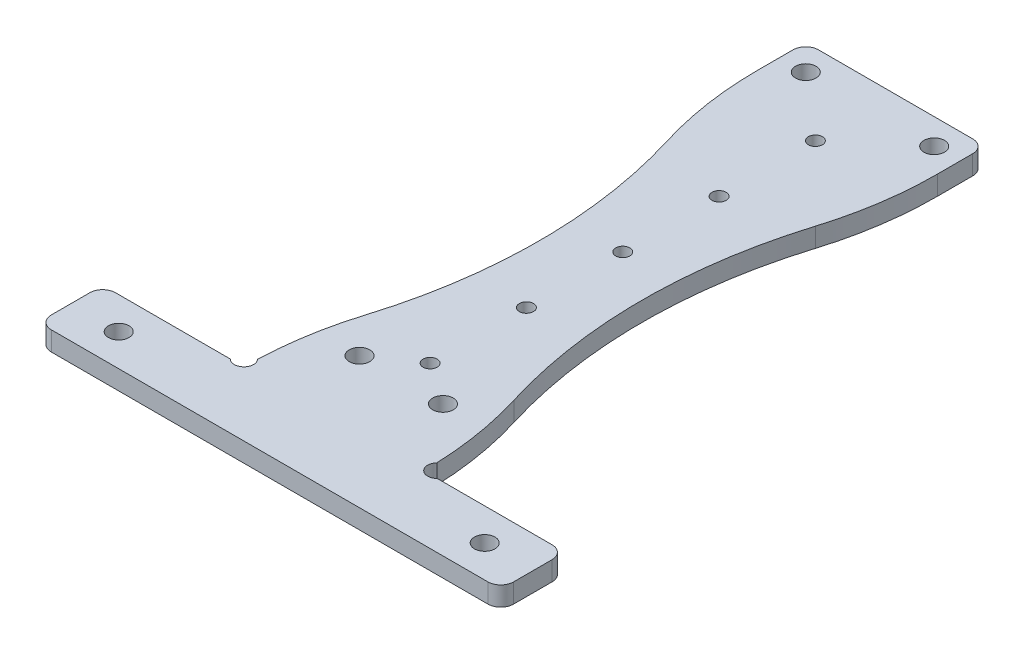
ISO-10303-21;
HEADER;
FILE_DESCRIPTION(('STEP AP214'),'2;1');
FILE_NAME('part.step','',(''),(''),'','','');
FILE_SCHEMA(('AUTOMOTIVE_DESIGN { 1 0 10303 214 1 1 1 1 }'));
ENDSEC;
DATA;
#1=APPLICATION_CONTEXT('core data for automotive mechanical design processes');
#2=APPLICATION_PROTOCOL_DEFINITION('international standard','automotive_design',2000,#1);
#3=PRODUCT_CONTEXT('',#1,'mechanical');
#4=PRODUCT('Part','Part','',(#3));
#5=PRODUCT_RELATED_PRODUCT_CATEGORY('part','',(#4));
#6=PRODUCT_DEFINITION_FORMATION('','',#4);
#7=PRODUCT_DEFINITION_CONTEXT('part definition',#1,'design');
#8=PRODUCT_DEFINITION('design','',#6,#7);
#9=PRODUCT_DEFINITION_SHAPE('','',#8);
#10=(LENGTH_UNIT() NAMED_UNIT(*) SI_UNIT(.MILLI.,.METRE.));
#11=(NAMED_UNIT(*) PLANE_ANGLE_UNIT() SI_UNIT($,.RADIAN.));
#12=(NAMED_UNIT(*) SI_UNIT($,.STERADIAN.) SOLID_ANGLE_UNIT());
#13=UNCERTAINTY_MEASURE_WITH_UNIT(LENGTH_MEASURE(1.E-05),#10,'distance_accuracy_value','');
#14=(GEOMETRIC_REPRESENTATION_CONTEXT(3) GLOBAL_UNCERTAINTY_ASSIGNED_CONTEXT((#13)) GLOBAL_UNIT_ASSIGNED_CONTEXT((#10,
#11,#12)) REPRESENTATION_CONTEXT('',''));
#15=CARTESIAN_POINT('',(0.,0.,0.));
#16=DIRECTION('',(0.,0.,1.));
#17=DIRECTION('',(1.,0.,0.));
#18=AXIS2_PLACEMENT_3D('',#15,#16,#17);
#19=CARTESIAN_POINT('',(-42.3333333333289,3.,-90.));
#20=DIRECTION('',(0.,-1.,0.));
#21=DIRECTION('',(0.,0.,-1.));
#22=AXIS2_PLACEMENT_3D('',#19,#20,#21);
#23=CYLINDRICAL_SURFACE('',#22,56.3333333333291);
#24=CARTESIAN_POINT('',(-42.3333333333289,0.,-90.));
#25=DIRECTION('',(0.,1.,0.));
#26=DIRECTION('',(0.,0.,1.));
#27=AXIS2_PLACEMENT_3D('',#24,#25,#26);
#28=CIRCLE('',#27,56.3333333333291);
#29=CARTESIAN_POINT('',(14.,0.,-90.));
#30=VERTEX_POINT('',#29);
#31=CARTESIAN_POINT('',(11.5207823960883,0.,-73.4718826405876));
#32=VERTEX_POINT('',#31);
#33=EDGE_CURVE('E193',#30,#32,#28,.F.);
#34=ORIENTED_EDGE('',*,*,#33,.F.);
#35=DIRECTION('',(0.,-1.,0.));
#36=VECTOR('',#35,1.);
#37=CARTESIAN_POINT('',(14.,3.,-90.));
#38=LINE('',#37,#36);
#39=CARTESIAN_POINT('',(14.,3.,-90.));
#40=VERTEX_POINT('',#39);
#41=EDGE_CURVE('E187',#40,#30,#38,.T.);
#42=ORIENTED_EDGE('',*,*,#41,.F.);
#43=CARTESIAN_POINT('',(-42.3333333333289,3.,-90.));
#44=DIRECTION('',(0.,1.,0.));
#45=DIRECTION('',(0.,0.,1.));
#46=AXIS2_PLACEMENT_3D('',#43,#44,#45);
#47=CIRCLE('',#46,56.3333333333291);
#48=CARTESIAN_POINT('',(11.5207823960883,3.,-73.4718826405876));
#49=VERTEX_POINT('',#48);
#50=EDGE_CURVE('E190',#40,#49,#47,.F.);
#51=ORIENTED_EDGE('',*,*,#50,.T.);
#52=DIRECTION('',(0.,-1.,0.));
#53=VECTOR('',#52,1.);
#54=CARTESIAN_POINT('',(11.5207823960883,3.,-73.4718826405876));
#55=LINE('',#54,#53);
#56=EDGE_CURVE('E259',#49,#32,#55,.T.);
#57=ORIENTED_EDGE('',*,*,#56,.T.);
#58=EDGE_LOOP('',(#34,#42,#51,#57));
#59=FACE_BOUND('',#58,.T.);
#60=ADVANCED_FACE('F37',(#59),#23,.T.);
#61=CARTESIAN_POINT('',(14.,3.,0.));
#62=DIRECTION('',(-1.,0.,0.));
#63=DIRECTION('',(0.,0.,1.));
#64=AXIS2_PLACEMENT_3D('',#61,#62,#63);
#65=PLANE('',#64);
#66=DIRECTION('',(0.,0.,-1.));
#67=VECTOR('',#66,1.);
#68=CARTESIAN_POINT('',(14.,0.,0.));
#69=LINE('',#68,#67);
#70=CARTESIAN_POINT('',(14.,0.,-95.5));
#71=VERTEX_POINT('',#70);
#72=EDGE_CURVE('E288',#30,#71,#69,.T.);
#73=ORIENTED_EDGE('',*,*,#72,.T.);
#74=DIRECTION('',(0.,-1.,0.));
#75=VECTOR('',#74,1.);
#76=CARTESIAN_POINT('',(14.,3.,-95.5));
#77=LINE('',#76,#75);
#78=CARTESIAN_POINT('',(14.,3.,-95.5));
#79=VERTEX_POINT('',#78);
#80=EDGE_CURVE('E11',#71,#79,#77,.F.);
#81=ORIENTED_EDGE('',*,*,#80,.T.);
#82=DIRECTION('',(0.,0.,-1.));
#83=VECTOR('',#82,1.);
#84=CARTESIAN_POINT('',(14.,3.,0.));
#85=LINE('',#84,#83);
#86=EDGE_CURVE('E201',#40,#79,#85,.T.);
#87=ORIENTED_EDGE('',*,*,#86,.F.);
#88=ORIENTED_EDGE('',*,*,#41,.T.);
#89=EDGE_LOOP('',(#73,#81,#87,#88));
#90=FACE_BOUND('',#89,.T.);
#91=ADVANCED_FACE('F202',(#90),#65,.F.);
#92=CARTESIAN_POINT('',(0.,3.,-97.5));
#93=DIRECTION('',(0.,0.,1.));
#94=DIRECTION('',(1.,0.,0.));
#95=AXIS2_PLACEMENT_3D('',#92,#93,#94);
#96=PLANE('',#95);
#97=DIRECTION('',(-1.,0.,0.));
#98=VECTOR('',#97,1.);
#99=CARTESIAN_POINT('',(0.,0.,-97.5));
#100=LINE('',#99,#98);
#101=CARTESIAN_POINT('',(12.,0.,-97.5));
#102=VERTEX_POINT('',#101);
#103=CARTESIAN_POINT('',(-12.,0.,-97.5));
#104=VERTEX_POINT('',#103);
#105=EDGE_CURVE('E290',#102,#104,#100,.T.);
#106=ORIENTED_EDGE('',*,*,#105,.T.);
#107=DIRECTION('',(0.,-1.,0.));
#108=VECTOR('',#107,1.);
#109=CARTESIAN_POINT('',(-12.,3.,-97.5));
#110=LINE('',#109,#108);
#111=CARTESIAN_POINT('',(-12.,3.,-97.5));
#112=VERTEX_POINT('',#111);
#113=EDGE_CURVE('E45',#104,#112,#110,.F.);
#114=ORIENTED_EDGE('',*,*,#113,.T.);
#115=DIRECTION('',(-1.,0.,0.));
#116=VECTOR('',#115,1.);
#117=CARTESIAN_POINT('',(0.,3.,-97.5));
#118=LINE('',#117,#116);
#119=CARTESIAN_POINT('',(12.,3.,-97.5));
#120=VERTEX_POINT('',#119);
#121=EDGE_CURVE('E205',#120,#112,#118,.T.);
#122=ORIENTED_EDGE('',*,*,#121,.F.);
#123=DIRECTION('',(0.,-1.,0.));
#124=VECTOR('',#123,1.);
#125=CARTESIAN_POINT('',(12.,3.,-97.5));
#126=LINE('',#125,#124);
#127=EDGE_CURVE('E400',#120,#102,#126,.T.);
#128=ORIENTED_EDGE('',*,*,#127,.T.);
#129=EDGE_LOOP('',(#106,#114,#122,#128));
#130=FACE_BOUND('',#129,.T.);
#131=ADVANCED_FACE('F405',(#130),#96,.F.);
#132=CARTESIAN_POINT('',(-14.,3.,0.));
#133=DIRECTION('',(-1.,0.,0.));
#134=DIRECTION('',(0.,0.,1.));
#135=AXIS2_PLACEMENT_3D('',#132,#133,#134);
#136=PLANE('',#135);
#137=DIRECTION('',(0.,0.,-1.));
#138=VECTOR('',#137,1.);
#139=CARTESIAN_POINT('',(-14.,3.,0.));
#140=LINE('',#139,#138);
#141=CARTESIAN_POINT('',(-14.,3.,-89.9999999999999));
#142=VERTEX_POINT('',#141);
#143=CARTESIAN_POINT('',(-14.,3.,-95.5));
#144=VERTEX_POINT('',#143);
#145=EDGE_CURVE('E222',#142,#144,#140,.T.);
#146=ORIENTED_EDGE('',*,*,#145,.T.);
#147=DIRECTION('',(0.,-1.,0.));
#148=VECTOR('',#147,1.);
#149=CARTESIAN_POINT('',(-14.,0.,-95.5));
#150=LINE('',#149,#148);
#151=CARTESIAN_POINT('',(-14.,0.,-95.5));
#152=VERTEX_POINT('',#151);
#153=EDGE_CURVE('E397',#144,#152,#150,.T.);
#154=ORIENTED_EDGE('',*,*,#153,.T.);
#155=DIRECTION('',(0.,0.,-1.));
#156=VECTOR('',#155,1.);
#157=CARTESIAN_POINT('',(-14.,0.,0.));
#158=LINE('',#157,#156);
#159=CARTESIAN_POINT('',(-14.,0.,-89.9999999999999));
#160=VERTEX_POINT('',#159);
#161=EDGE_CURVE('E293',#160,#152,#158,.T.);
#162=ORIENTED_EDGE('',*,*,#161,.F.);
#163=DIRECTION('',(0.,-1.,0.));
#164=VECTOR('',#163,1.);
#165=CARTESIAN_POINT('',(-14.,3.,-89.9999999999999));
#166=LINE('',#165,#164);
#167=EDGE_CURVE('E198',#142,#160,#166,.T.);
#168=ORIENTED_EDGE('',*,*,#167,.F.);
#169=EDGE_LOOP('',(#146,#154,#162,#168));
#170=FACE_BOUND('',#169,.T.);
#171=ADVANCED_FACE('F415',(#170),#136,.T.);
#172=CARTESIAN_POINT('',(42.3333333333292,3.,-89.9999999999999));
#173=DIRECTION('',(0.,-1.,0.));
#174=DIRECTION('',(0.,0.,-1.));
#175=AXIS2_PLACEMENT_3D('',#172,#173,#174);
#176=CYLINDRICAL_SURFACE('',#175,56.3333333333293);
#177=CARTESIAN_POINT('',(42.3333333333292,0.,-89.9999999999999));
#178=DIRECTION('',(0.,1.,0.));
#179=DIRECTION('',(0.,0.,1.));
#180=AXIS2_PLACEMENT_3D('',#177,#178,#179);
#181=CIRCLE('',#180,56.3333333333293);
#182=CARTESIAN_POINT('',(-11.5207823960882,0.,-73.4718826405876));
#183=VERTEX_POINT('',#182);
#184=EDGE_CURVE('E296',#160,#183,#181,.T.);
#185=ORIENTED_EDGE('',*,*,#184,.T.);
#186=DIRECTION('',(0.,-1.,0.));
#187=VECTOR('',#186,1.);
#188=CARTESIAN_POINT('',(-11.5207823960882,3.,-73.4718826405876));
#189=LINE('',#188,#187);
#190=CARTESIAN_POINT('',(-11.5207823960882,3.,-73.4718826405876));
#191=VERTEX_POINT('',#190);
#192=EDGE_CURVE('E352',#191,#183,#189,.T.);
#193=ORIENTED_EDGE('',*,*,#192,.F.);
#194=CARTESIAN_POINT('',(42.3333333333292,3.,-89.9999999999999));
#195=DIRECTION('',(0.,1.,0.));
#196=DIRECTION('',(0.,0.,1.));
#197=AXIS2_PLACEMENT_3D('',#194,#195,#196);
#198=CIRCLE('',#197,56.3333333333293);
#199=EDGE_CURVE('E225',#142,#191,#198,.T.);
#200=ORIENTED_EDGE('',*,*,#199,.F.);
#201=ORIENTED_EDGE('',*,*,#167,.T.);
#202=EDGE_LOOP('',(#185,#193,#200,#201));
#203=FACE_BOUND('',#202,.T.);
#204=ADVANCED_FACE('F423',(#203),#176,.T.);
#205=CARTESIAN_POINT('',(-88.0000000000002,3.,-50.));
#206=DIRECTION('',(0.,-1.,0.));
#207=DIRECTION('',(0.,0.,-1.));
#208=AXIS2_PLACEMENT_3D('',#205,#206,#207);
#209=CYLINDRICAL_SURFACE('',#208,80.0000000000002);
#210=CARTESIAN_POINT('',(-88.0000000000002,0.,-50.));
#211=DIRECTION('',(0.,1.,0.));
#212=DIRECTION('',(0.,0.,1.));
#213=AXIS2_PLACEMENT_3D('',#210,#211,#212);
#214=CIRCLE('',#213,80.0000000000002);
#215=CARTESIAN_POINT('',(-11.5207823960883,0.,-26.5281173594124));
#216=VERTEX_POINT('',#215);
#217=EDGE_CURVE('E299',#183,#216,#214,.F.);
#218=ORIENTED_EDGE('',*,*,#217,.T.);
#219=DIRECTION('',(0.,-1.,0.));
#220=VECTOR('',#219,1.);
#221=CARTESIAN_POINT('',(-11.5207823960883,3.,-26.5281173594124));
#222=LINE('',#221,#220);
#223=CARTESIAN_POINT('',(-11.5207823960883,3.,-26.5281173594124));
#224=VERTEX_POINT('',#223);
#225=EDGE_CURVE('E349',#224,#216,#222,.T.);
#226=ORIENTED_EDGE('',*,*,#225,.F.);
#227=CARTESIAN_POINT('',(-88.0000000000002,3.,-50.));
#228=DIRECTION('',(0.,1.,0.));
#229=DIRECTION('',(0.,0.,1.));
#230=AXIS2_PLACEMENT_3D('',#227,#228,#229);
#231=CIRCLE('',#230,80.0000000000002);
#232=EDGE_CURVE('E228',#191,#224,#231,.F.);
#233=ORIENTED_EDGE('',*,*,#232,.F.);
#234=ORIENTED_EDGE('',*,*,#192,.T.);
#235=EDGE_LOOP('',(#218,#226,#233,#234));
#236=FACE_BOUND('',#235,.T.);
#237=ADVANCED_FACE('F429',(#236),#209,.F.);
#238=CARTESIAN_POINT('',(42.333333333329,3.,-9.99999999999999));
#239=DIRECTION('',(0.,-1.,0.));
#240=DIRECTION('',(0.,0.,-1.));
#241=AXIS2_PLACEMENT_3D('',#238,#239,#240);
#242=CYLINDRICAL_SURFACE('',#241,56.3333333333292);
#243=CARTESIAN_POINT('',(42.333333333329,0.,-9.99999999999999));
#244=DIRECTION('',(0.,1.,0.));
#245=DIRECTION('',(0.,0.,1.));
#246=AXIS2_PLACEMENT_3D('',#243,#244,#245);
#247=CIRCLE('',#246,56.3333333333292);
#248=CARTESIAN_POINT('',(-13.9615349073017,0.,-12.0814067872462));
#249=VERTEX_POINT('',#248);
#250=EDGE_CURVE('E302',#216,#249,#247,.T.);
#251=ORIENTED_EDGE('',*,*,#250,.T.);
#252=DIRECTION('',(0.,-1.,0.));
#253=VECTOR('',#252,1.);
#254=CARTESIAN_POINT('',(-13.9615349073017,3.,-12.0814067872462));
#255=LINE('',#254,#253);
#256=CARTESIAN_POINT('',(-13.9615349073017,3.,-12.0814067872462));
#257=VERTEX_POINT('',#256);
#258=EDGE_CURVE('E347',#257,#249,#255,.T.);
#259=ORIENTED_EDGE('',*,*,#258,.F.);
#260=CARTESIAN_POINT('',(42.333333333329,3.,-9.99999999999999));
#261=DIRECTION('',(0.,1.,0.));
#262=DIRECTION('',(0.,0.,1.));
#263=AXIS2_PLACEMENT_3D('',#260,#261,#262);
#264=CIRCLE('',#263,56.3333333333292);
#265=EDGE_CURVE('E231',#224,#257,#264,.T.);
#266=ORIENTED_EDGE('',*,*,#265,.F.);
#267=ORIENTED_EDGE('',*,*,#225,.T.);
#268=EDGE_LOOP('',(#251,#259,#266,#267));
#269=FACE_BOUND('',#268,.T.);
#270=ADVANCED_FACE('F431',(#269),#242,.T.);
#271=CARTESIAN_POINT('',(-15.0606601717798,3.,-11.0606601717798));
#272=DIRECTION('',(0.,-1.,0.));
#273=DIRECTION('',(0.,0.,-1.));
#274=AXIS2_PLACEMENT_3D('',#271,#272,#273);
#275=CYLINDRICAL_SURFACE('',#274,1.50000000000001);
#276=CARTESIAN_POINT('',(-15.0606601717798,0.,-11.0606601717798));
#277=DIRECTION('',(0.,1.,0.));
#278=DIRECTION('',(0.,0.,1.));
#279=AXIS2_PLACEMENT_3D('',#276,#277,#278);
#280=CIRCLE('',#279,1.50000000000001);
#281=CARTESIAN_POINT('',(-16.1213203435596,0.,-10.));
#282=VERTEX_POINT('',#281);
#283=EDGE_CURVE('E305',#282,#249,#280,.T.);
#284=ORIENTED_EDGE('',*,*,#283,.F.);
#285=DIRECTION('',(0.,-1.,0.));
#286=VECTOR('',#285,1.);
#287=CARTESIAN_POINT('',(-16.1213203435596,3.,-10.));
#288=LINE('',#287,#286);
#289=CARTESIAN_POINT('',(-16.1213203435596,3.,-10.));
#290=VERTEX_POINT('',#289);
#291=EDGE_CURVE('E344',#290,#282,#288,.T.);
#292=ORIENTED_EDGE('',*,*,#291,.F.);
#293=CARTESIAN_POINT('',(-15.0606601717798,3.,-11.0606601717798));
#294=DIRECTION('',(0.,1.,0.));
#295=DIRECTION('',(0.,0.,1.));
#296=AXIS2_PLACEMENT_3D('',#293,#294,#295);
#297=CIRCLE('',#296,1.50000000000001);
#298=EDGE_CURVE('E233',#290,#257,#297,.T.);
#299=ORIENTED_EDGE('',*,*,#298,.T.);
#300=ORIENTED_EDGE('',*,*,#258,.T.);
#301=EDGE_LOOP('',(#284,#292,#299,#300));
#302=FACE_BOUND('',#301,.T.);
#303=ADVANCED_FACE('F435',(#302),#275,.F.);
#304=CARTESIAN_POINT('',(0.,3.,-10.));
#305=DIRECTION('',(0.,0.,-1.));
#306=DIRECTION('',(-1.,0.,0.));
#307=AXIS2_PLACEMENT_3D('',#304,#305,#306);
#308=PLANE('',#307);
#309=DIRECTION('',(1.,0.,0.));
#310=VECTOR('',#309,1.);
#311=CARTESIAN_POINT('',(0.,0.,-10.));
#312=LINE('',#311,#310);
#313=CARTESIAN_POINT('',(-34.,0.,-10.));
#314=VERTEX_POINT('',#313);
#315=EDGE_CURVE('E308',#314,#282,#312,.T.);
#316=ORIENTED_EDGE('',*,*,#315,.F.);
#317=DIRECTION('',(0.,-1.,0.));
#318=VECTOR('',#317,1.);
#319=CARTESIAN_POINT('',(-34.,3.,-10.));
#320=LINE('',#319,#318);
#321=CARTESIAN_POINT('',(-34.,3.,-10.));
#322=VERTEX_POINT('',#321);
#323=EDGE_CURVE('E395',#314,#322,#320,.F.);
#324=ORIENTED_EDGE('',*,*,#323,.T.);
#325=DIRECTION('',(1.,0.,0.));
#326=VECTOR('',#325,1.);
#327=CARTESIAN_POINT('',(0.,3.,-10.));
#328=LINE('',#327,#326);
#329=EDGE_CURVE('E236',#322,#290,#328,.T.);
#330=ORIENTED_EDGE('',*,*,#329,.T.);
#331=ORIENTED_EDGE('',*,*,#291,.T.);
#332=EDGE_LOOP('',(#316,#324,#330,#331));
#333=FACE_BOUND('',#332,.T.);
#334=ADVANCED_FACE('F698',(#333),#308,.T.);
#335=CARTESIAN_POINT('',(-36.,3.,0.));
#336=DIRECTION('',(-1.,0.,0.));
#337=DIRECTION('',(0.,0.,1.));
#338=AXIS2_PLACEMENT_3D('',#335,#336,#337);
#339=PLANE('',#338);
#340=DIRECTION('',(0.,0.,-1.));
#341=VECTOR('',#340,1.);
#342=CARTESIAN_POINT('',(-36.,0.,0.));
#343=LINE('',#342,#341);
#344=CARTESIAN_POINT('',(-36.,0.,-2.));
#345=VERTEX_POINT('',#344);
#346=CARTESIAN_POINT('',(-36.,0.,-8.));
#347=VERTEX_POINT('',#346);
#348=EDGE_CURVE('E310',#345,#347,#343,.T.);
#349=ORIENTED_EDGE('',*,*,#348,.F.);
#350=DIRECTION('',(0.,-1.,0.));
#351=VECTOR('',#350,1.);
#352=CARTESIAN_POINT('',(-36.,3.,-2.));
#353=LINE('',#352,#351);
#354=CARTESIAN_POINT('',(-36.,3.,-2.));
#355=VERTEX_POINT('',#354);
#356=EDGE_CURVE('E393',#345,#355,#353,.F.);
#357=ORIENTED_EDGE('',*,*,#356,.T.);
#358=DIRECTION('',(0.,0.,-1.));
#359=VECTOR('',#358,1.);
#360=CARTESIAN_POINT('',(-36.,3.,0.));
#361=LINE('',#360,#359);
#362=CARTESIAN_POINT('',(-36.,3.,-8.));
#363=VERTEX_POINT('',#362);
#364=EDGE_CURVE('E238',#355,#363,#361,.T.);
#365=ORIENTED_EDGE('',*,*,#364,.T.);
#366=DIRECTION('',(0.,-1.,0.));
#367=VECTOR('',#366,1.);
#368=CARTESIAN_POINT('',(-36.,3.,-8.));
#369=LINE('',#368,#367);
#370=EDGE_CURVE('E390',#363,#347,#369,.T.);
#371=ORIENTED_EDGE('',*,*,#370,.T.);
#372=EDGE_LOOP('',(#349,#357,#365,#371));
#373=FACE_BOUND('',#372,.T.);
#374=ADVANCED_FACE('F445',(#373),#339,.T.);
#375=CARTESIAN_POINT('',(0.,3.,0.));
#376=DIRECTION('',(0.,0.,-1.));
#377=DIRECTION('',(-1.,0.,0.));
#378=AXIS2_PLACEMENT_3D('',#375,#376,#377);
#379=PLANE('',#378);
#380=DIRECTION('',(1.,0.,0.));
#381=VECTOR('',#380,1.);
#382=CARTESIAN_POINT('',(0.,0.,0.));
#383=LINE('',#382,#381);
#384=CARTESIAN_POINT('',(-34.,0.,0.));
#385=VERTEX_POINT('',#384);
#386=CARTESIAN_POINT('',(34.,0.,0.));
#387=VERTEX_POINT('',#386);
#388=EDGE_CURVE('E313',#385,#387,#383,.T.);
#389=ORIENTED_EDGE('',*,*,#388,.T.);
#390=DIRECTION('',(0.,-1.,0.));
#391=VECTOR('',#390,1.);
#392=CARTESIAN_POINT('',(34.,3.,0.));
#393=LINE('',#392,#391);
#394=CARTESIAN_POINT('',(34.,3.,0.));
#395=VERTEX_POINT('',#394);
#396=EDGE_CURVE('E52',#387,#395,#393,.F.);
#397=ORIENTED_EDGE('',*,*,#396,.T.);
#398=DIRECTION('',(1.,0.,0.));
#399=VECTOR('',#398,1.);
#400=CARTESIAN_POINT('',(0.,3.,0.));
#401=LINE('',#400,#399);
#402=CARTESIAN_POINT('',(-34.,3.,0.));
#403=VERTEX_POINT('',#402);
#404=EDGE_CURVE('E241',#403,#395,#401,.T.);
#405=ORIENTED_EDGE('',*,*,#404,.F.);
#406=DIRECTION('',(0.,-1.,0.));
#407=VECTOR('',#406,1.);
#408=CARTESIAN_POINT('',(-34.,0.,0.));
#409=LINE('',#408,#407);
#410=EDGE_CURVE('E386',#403,#385,#409,.T.);
#411=ORIENTED_EDGE('',*,*,#410,.T.);
#412=EDGE_LOOP('',(#389,#397,#405,#411));
#413=FACE_BOUND('',#412,.T.);
#414=ADVANCED_FACE('F452',(#413),#379,.F.);
#415=CARTESIAN_POINT('',(36.,3.,0.));
#416=DIRECTION('',(-1.,0.,0.));
#417=DIRECTION('',(0.,0.,1.));
#418=AXIS2_PLACEMENT_3D('',#415,#416,#417);
#419=PLANE('',#418);
#420=DIRECTION('',(0.,0.,-1.));
#421=VECTOR('',#420,1.);
#422=CARTESIAN_POINT('',(36.,0.,0.));
#423=LINE('',#422,#421);
#424=CARTESIAN_POINT('',(36.,0.,-2.00000000000001));
#425=VERTEX_POINT('',#424);
#426=CARTESIAN_POINT('',(36.,0.,-8.));
#427=VERTEX_POINT('',#426);
#428=EDGE_CURVE('E315',#425,#427,#423,.T.);
#429=ORIENTED_EDGE('',*,*,#428,.T.);
#430=DIRECTION('',(0.,-1.,0.));
#431=VECTOR('',#430,1.);
#432=CARTESIAN_POINT('',(36.,3.,-8.));
#433=LINE('',#432,#431);
#434=CARTESIAN_POINT('',(36.,3.,-8.));
#435=VERTEX_POINT('',#434);
#436=EDGE_CURVE('E373',#427,#435,#433,.F.);
#437=ORIENTED_EDGE('',*,*,#436,.T.);
#438=DIRECTION('',(0.,0.,-1.));
#439=VECTOR('',#438,1.);
#440=CARTESIAN_POINT('',(36.,3.,0.));
#441=LINE('',#440,#439);
#442=CARTESIAN_POINT('',(36.,3.,-2.00000000000001));
#443=VERTEX_POINT('',#442);
#444=EDGE_CURVE('E243',#443,#435,#441,.T.);
#445=ORIENTED_EDGE('',*,*,#444,.F.);
#446=DIRECTION('',(0.,-1.,0.));
#447=VECTOR('',#446,1.);
#448=CARTESIAN_POINT('',(36.,3.,-2.00000000000001));
#449=LINE('',#448,#447);
#450=EDGE_CURVE('E370',#443,#425,#449,.T.);
#451=ORIENTED_EDGE('',*,*,#450,.T.);
#452=EDGE_LOOP('',(#429,#437,#445,#451));
#453=FACE_BOUND('',#452,.T.);
#454=ADVANCED_FACE('F460',(#453),#419,.F.);
#455=CARTESIAN_POINT('',(0.,3.,-10.));
#456=DIRECTION('',(0.,0.,1.));
#457=DIRECTION('',(1.,0.,0.));
#458=AXIS2_PLACEMENT_3D('',#455,#456,#457);
#459=PLANE('',#458);
#460=DIRECTION('',(-1.,0.,0.));
#461=VECTOR('',#460,1.);
#462=CARTESIAN_POINT('',(0.,3.,-10.));
#463=LINE('',#462,#461);
#464=CARTESIAN_POINT('',(34.,3.,-10.));
#465=VERTEX_POINT('',#464);
#466=CARTESIAN_POINT('',(16.1213203435596,3.,-10.));
#467=VERTEX_POINT('',#466);
#468=EDGE_CURVE('E245',#465,#467,#463,.T.);
#469=ORIENTED_EDGE('',*,*,#468,.F.);
#470=DIRECTION('',(0.,-1.,0.));
#471=VECTOR('',#470,1.);
#472=CARTESIAN_POINT('',(34.,3.,-10.));
#473=LINE('',#472,#471);
#474=CARTESIAN_POINT('',(34.,0.,-10.));
#475=VERTEX_POINT('',#474);
#476=EDGE_CURVE('E197',#465,#475,#473,.T.);
#477=ORIENTED_EDGE('',*,*,#476,.T.);
#478=DIRECTION('',(-1.,0.,0.));
#479=VECTOR('',#478,1.);
#480=CARTESIAN_POINT('',(0.,0.,-10.));
#481=LINE('',#480,#479);
#482=CARTESIAN_POINT('',(16.1213203435596,0.,-10.));
#483=VERTEX_POINT('',#482);
#484=EDGE_CURVE('E318',#475,#483,#481,.T.);
#485=ORIENTED_EDGE('',*,*,#484,.T.);
#486=DIRECTION('',(0.,-1.,0.));
#487=VECTOR('',#486,1.);
#488=CARTESIAN_POINT('',(16.1213203435596,3.,-10.));
#489=LINE('',#488,#487);
#490=EDGE_CURVE('E341',#467,#483,#489,.T.);
#491=ORIENTED_EDGE('',*,*,#490,.F.);
#492=EDGE_LOOP('',(#469,#477,#485,#491));
#493=FACE_BOUND('',#492,.T.);
#494=ADVANCED_FACE('F469',(#493),#459,.F.);
#495=CARTESIAN_POINT('',(15.0606601717798,3.,-11.0606601717798));
#496=DIRECTION('',(0.,-1.,0.));
#497=DIRECTION('',(0.,0.,-1.));
#498=AXIS2_PLACEMENT_3D('',#495,#496,#497);
#499=CYLINDRICAL_SURFACE('',#498,1.5);
#500=CARTESIAN_POINT('',(15.0606601717798,0.,-11.0606601717798));
#501=DIRECTION('',(0.,1.,0.));
#502=DIRECTION('',(0.,0.,1.));
#503=AXIS2_PLACEMENT_3D('',#500,#501,#502);
#504=CIRCLE('',#503,1.5);
#505=CARTESIAN_POINT('',(13.9615349073018,0.,-12.0814067872462));
#506=VERTEX_POINT('',#505);
#507=EDGE_CURVE('E320',#483,#506,#504,.F.);
#508=ORIENTED_EDGE('',*,*,#507,.T.);
#509=DIRECTION('',(0.,-1.,0.));
#510=VECTOR('',#509,1.);
#511=CARTESIAN_POINT('',(13.9615349073018,3.,-12.0814067872462));
#512=LINE('',#511,#510);
#513=CARTESIAN_POINT('',(13.9615349073018,3.,-12.0814067872462));
#514=VERTEX_POINT('',#513);
#515=EDGE_CURVE('E339',#514,#506,#512,.T.);
#516=ORIENTED_EDGE('',*,*,#515,.F.);
#517=CARTESIAN_POINT('',(15.0606601717798,3.,-11.0606601717798));
#518=DIRECTION('',(0.,1.,0.));
#519=DIRECTION('',(0.,0.,1.));
#520=AXIS2_PLACEMENT_3D('',#517,#518,#519);
#521=CIRCLE('',#520,1.5);
#522=EDGE_CURVE('E247',#467,#514,#521,.F.);
#523=ORIENTED_EDGE('',*,*,#522,.F.);
#524=ORIENTED_EDGE('',*,*,#490,.T.);
#525=EDGE_LOOP('',(#508,#516,#523,#524));
#526=FACE_BOUND('',#525,.T.);
#527=ADVANCED_FACE('F474',(#526),#499,.F.);
#528=CARTESIAN_POINT('',(-42.3333333333289,3.,-9.99999999999995));
#529=DIRECTION('',(0.,-1.,0.));
#530=DIRECTION('',(0.,0.,-1.));
#531=AXIS2_PLACEMENT_3D('',#528,#529,#530);
#532=CYLINDRICAL_SURFACE('',#531,56.3333333333291);
#533=CARTESIAN_POINT('',(-42.3333333333289,0.,-9.99999999999995));
#534=DIRECTION('',(0.,1.,0.));
#535=DIRECTION('',(0.,0.,1.));
#536=AXIS2_PLACEMENT_3D('',#533,#534,#535);
#537=CIRCLE('',#536,56.3333333333291);
#538=CARTESIAN_POINT('',(11.5207823960882,0.,-26.5281173594124));
#539=VERTEX_POINT('',#538);
#540=EDGE_CURVE('E323',#539,#506,#537,.F.);
#541=ORIENTED_EDGE('',*,*,#540,.F.);
#542=DIRECTION('',(0.,-1.,0.));
#543=VECTOR('',#542,1.);
#544=CARTESIAN_POINT('',(11.5207823960882,3.,-26.5281173594124));
#545=LINE('',#544,#543);
#546=CARTESIAN_POINT('',(11.5207823960882,3.,-26.5281173594124));
#547=VERTEX_POINT('',#546);
#548=EDGE_CURVE('E337',#547,#539,#545,.T.);
#549=ORIENTED_EDGE('',*,*,#548,.F.);
#550=CARTESIAN_POINT('',(-42.3333333333289,3.,-9.99999999999995));
#551=DIRECTION('',(0.,1.,0.));
#552=DIRECTION('',(0.,0.,1.));
#553=AXIS2_PLACEMENT_3D('',#550,#551,#552);
#554=CIRCLE('',#553,56.3333333333291);
#555=EDGE_CURVE('E249',#547,#514,#554,.F.);
#556=ORIENTED_EDGE('',*,*,#555,.T.);
#557=ORIENTED_EDGE('',*,*,#515,.T.);
#558=EDGE_LOOP('',(#541,#549,#556,#557));
#559=FACE_BOUND('',#558,.T.);
#560=ADVANCED_FACE('F477',(#559),#532,.T.);
#561=CARTESIAN_POINT('',(-6.49999999999999,3.,-20.5));
#562=DIRECTION('',(0.,-1.,0.));
#563=DIRECTION('',(0.,0.,-1.));
#564=AXIS2_PLACEMENT_3D('',#561,#562,#563);
#565=CYLINDRICAL_SURFACE('',#564,1.6);
#566=CARTESIAN_POINT('',(-6.49999999999999,3.,-20.5));
#567=DIRECTION('',(0.,1.,0.));
#568=DIRECTION('',(0.,0.,1.));
#569=AXIS2_PLACEMENT_3D('',#566,#567,#568);
#570=CIRCLE('',#569,1.6);
#571=CARTESIAN_POINT('',(-6.49999999999999,3.,-18.9));
#572=VERTEX_POINT('',#571);
#573=EDGE_CURVE('E253',#572,#572,#570,.T.);
#574=ORIENTED_EDGE('',*,*,#573,.T.);
#575=EDGE_LOOP('',(#574));
#576=FACE_BOUND('',#575,.T.);
#577=CARTESIAN_POINT('',(-6.49999999999999,0.,-20.5));
#578=DIRECTION('',(0.,1.,0.));
#579=DIRECTION('',(0.,0.,1.));
#580=AXIS2_PLACEMENT_3D('',#577,#578,#579);
#581=CIRCLE('',#580,1.6);
#582=CARTESIAN_POINT('',(-6.49999999999999,0.,-18.9));
#583=VERTEX_POINT('',#582);
#584=EDGE_CURVE('E329',#583,#583,#581,.T.);
#585=ORIENTED_EDGE('',*,*,#584,.F.);
#586=EDGE_LOOP('',(#585));
#587=FACE_BOUND('',#586,.T.);
#588=ADVANCED_FACE('F647',(#576,#587),#565,.F.);
#589=CARTESIAN_POINT('',(88.0000000000002,3.,-50.));
#590=DIRECTION('',(0.,-1.,0.));
#591=DIRECTION('',(0.,0.,-1.));
#592=AXIS2_PLACEMENT_3D('',#589,#590,#591);
#593=CYLINDRICAL_SURFACE('',#592,80.0000000000002);
#594=CARTESIAN_POINT('',(88.0000000000002,0.,-50.));
#595=DIRECTION('',(0.,1.,0.));
#596=DIRECTION('',(0.,0.,1.));
#597=AXIS2_PLACEMENT_3D('',#594,#595,#596);
#598=CIRCLE('',#597,80.0000000000002);
#599=EDGE_CURVE('E326',#32,#539,#598,.T.);
#600=ORIENTED_EDGE('',*,*,#599,.F.);
#601=ORIENTED_EDGE('',*,*,#56,.F.);
#602=CARTESIAN_POINT('',(88.0000000000002,3.,-50.));
#603=DIRECTION('',(0.,1.,0.));
#604=DIRECTION('',(0.,0.,1.));
#605=AXIS2_PLACEMENT_3D('',#602,#603,#604);
#606=CIRCLE('',#605,80.0000000000002);
#607=EDGE_CURVE('E212',#49,#547,#606,.T.);
#608=ORIENTED_EDGE('',*,*,#607,.T.);
#609=ORIENTED_EDGE('',*,*,#548,.T.);
#610=EDGE_LOOP('',(#600,#601,#608,#609));
#611=FACE_BOUND('',#610,.T.);
#612=ADVANCED_FACE('F480',(#611),#593,.F.);
#613=CARTESIAN_POINT('',(6.2499719403981E-13,3.,-25.));
#614=DIRECTION('',(0.,-1.,0.));
#615=DIRECTION('',(0.,0.,-1.));
#616=AXIS2_PLACEMENT_3D('',#613,#614,#615);
#617=CYLINDRICAL_SURFACE('',#616,1.1);
#618=CARTESIAN_POINT('',(6.2499719403981E-13,3.,-25.));
#619=DIRECTION('',(0.,1.,0.));
#620=DIRECTION('',(0.,0.,1.));
#621=AXIS2_PLACEMENT_3D('',#618,#619,#620);
#622=CIRCLE('',#621,1.1);
#623=CARTESIAN_POINT('',(6.2499719403981E-13,3.,-23.9));
#624=VERTEX_POINT('',#623);
#625=EDGE_CURVE('E213',#624,#624,#622,.T.);
#626=ORIENTED_EDGE('',*,*,#625,.T.);
#627=EDGE_LOOP('',(#626));
#628=FACE_BOUND('',#627,.T.);
#629=CARTESIAN_POINT('',(6.2499719403981E-13,0.,-25.));
#630=DIRECTION('',(0.,1.,0.));
#631=DIRECTION('',(0.,0.,1.));
#632=AXIS2_PLACEMENT_3D('',#629,#630,#631);
#633=CIRCLE('',#632,1.1);
#634=CARTESIAN_POINT('',(6.2499719403981E-13,0.,-23.9));
#635=VERTEX_POINT('',#634);
#636=EDGE_CURVE('E284',#635,#635,#633,.T.);
#637=ORIENTED_EDGE('',*,*,#636,.F.);
#638=EDGE_LOOP('',(#637));
#639=FACE_BOUND('',#638,.T.);
#640=ADVANCED_FACE('F494',(#628,#639),#617,.F.);
#641=CARTESIAN_POINT('',(4.67880533791869E-13,3.,-40.));
#642=DIRECTION('',(0.,-1.,0.));
#643=DIRECTION('',(0.,0.,-1.));
#644=AXIS2_PLACEMENT_3D('',#641,#642,#643);
#645=CYLINDRICAL_SURFACE('',#644,1.1);
#646=CARTESIAN_POINT('',(4.67880533791869E-13,3.,-40.));
#647=DIRECTION('',(0.,1.,0.));
#648=DIRECTION('',(0.,0.,1.));
#649=AXIS2_PLACEMENT_3D('',#646,#647,#648);
#650=CIRCLE('',#649,1.1);
#651=CARTESIAN_POINT('',(4.67880533791869E-13,3.,-38.9));
#652=VERTEX_POINT('',#651);
#653=EDGE_CURVE('E216',#652,#652,#650,.T.);
#654=ORIENTED_EDGE('',*,*,#653,.T.);
#655=EDGE_LOOP('',(#654));
#656=FACE_BOUND('',#655,.T.);
#657=CARTESIAN_POINT('',(4.67880533791869E-13,0.,-40.));
#658=DIRECTION('',(0.,1.,0.));
#659=DIRECTION('',(0.,0.,1.));
#660=AXIS2_PLACEMENT_3D('',#657,#658,#659);
#661=CIRCLE('',#660,1.1);
#662=CARTESIAN_POINT('',(4.67880533791869E-13,0.,-38.9));
#663=VERTEX_POINT('',#662);
#664=EDGE_CURVE('E281',#663,#663,#661,.T.);
#665=ORIENTED_EDGE('',*,*,#664,.F.);
#666=EDGE_LOOP('',(#665));
#667=FACE_BOUND('',#666,.T.);
#668=ADVANCED_FACE('F497',(#656,#667),#645,.F.);
#669=CARTESIAN_POINT('',(3.10763873543928E-13,3.,-55.));
#670=DIRECTION('',(0.,-1.,0.));
#671=DIRECTION('',(0.,0.,-1.));
#672=AXIS2_PLACEMENT_3D('',#669,#670,#671);
#673=CYLINDRICAL_SURFACE('',#672,1.1);
#674=CARTESIAN_POINT('',(3.10763873543928E-13,3.,-55.));
#675=DIRECTION('',(0.,1.,0.));
#676=DIRECTION('',(0.,0.,1.));
#677=AXIS2_PLACEMENT_3D('',#674,#675,#676);
#678=CIRCLE('',#677,1.1);
#679=CARTESIAN_POINT('',(3.10763873543928E-13,3.,-53.9));
#680=VERTEX_POINT('',#679);
#681=EDGE_CURVE('E819',#680,#680,#678,.T.);
#682=ORIENTED_EDGE('',*,*,#681,.T.);
#683=EDGE_LOOP('',(#682));
#684=FACE_BOUND('',#683,.T.);
#685=CARTESIAN_POINT('',(3.10763873543928E-13,0.,-55.));
#686=DIRECTION('',(0.,1.,0.));
#687=DIRECTION('',(0.,0.,1.));
#688=AXIS2_PLACEMENT_3D('',#685,#686,#687);
#689=CIRCLE('',#688,1.1);
#690=CARTESIAN_POINT('',(3.10763873543928E-13,0.,-53.9));
#691=VERTEX_POINT('',#690);
#692=EDGE_CURVE('E278',#691,#691,#689,.T.);
#693=ORIENTED_EDGE('',*,*,#692,.F.);
#694=EDGE_LOOP('',(#693));
#695=FACE_BOUND('',#694,.T.);
#696=ADVANCED_FACE('F501',(#684,#695),#673,.F.);
#697=CARTESIAN_POINT('',(1.53647213295987E-13,3.,-70.));
#698=DIRECTION('',(0.,-1.,0.));
#699=DIRECTION('',(0.,0.,-1.));
#700=AXIS2_PLACEMENT_3D('',#697,#698,#699);
#701=CYLINDRICAL_SURFACE('',#700,1.1);
#702=CARTESIAN_POINT('',(1.53647213295987E-13,3.,-70.));
#703=DIRECTION('',(0.,1.,0.));
#704=DIRECTION('',(0.,0.,1.));
#705=AXIS2_PLACEMENT_3D('',#702,#703,#704);
#706=CIRCLE('',#705,1.1);
#707=CARTESIAN_POINT('',(1.53647213295987E-13,3.,-68.9));
#708=VERTEX_POINT('',#707);
#709=EDGE_CURVE('E815',#708,#708,#706,.T.);
#710=ORIENTED_EDGE('',*,*,#709,.T.);
#711=EDGE_LOOP('',(#710));
#712=FACE_BOUND('',#711,.T.);
#713=CARTESIAN_POINT('',(1.53647213295987E-13,0.,-70.));
#714=DIRECTION('',(0.,1.,0.));
#715=DIRECTION('',(0.,0.,1.));
#716=AXIS2_PLACEMENT_3D('',#713,#714,#715);
#717=CIRCLE('',#716,1.1);
#718=CARTESIAN_POINT('',(1.53647213295987E-13,0.,-68.9));
#719=VERTEX_POINT('',#718);
#720=EDGE_CURVE('E275',#719,#719,#717,.T.);
#721=ORIENTED_EDGE('',*,*,#720,.F.);
#722=EDGE_LOOP('',(#721));
#723=FACE_BOUND('',#722,.T.);
#724=ADVANCED_FACE('F505',(#712,#723),#701,.F.);
#725=CARTESIAN_POINT('',(0.,3.,-85.));
#726=DIRECTION('',(0.,-1.,0.));
#727=DIRECTION('',(0.,0.,-1.));
#728=AXIS2_PLACEMENT_3D('',#725,#726,#727);
#729=CYLINDRICAL_SURFACE('',#728,1.1);
#730=CARTESIAN_POINT('',(0.,3.,-85.));
#731=DIRECTION('',(0.,1.,0.));
#732=DIRECTION('',(0.,0.,1.));
#733=AXIS2_PLACEMENT_3D('',#730,#731,#732);
#734=CIRCLE('',#733,1.1);
#735=CARTESIAN_POINT('',(0.,3.,-83.9));
#736=VERTEX_POINT('',#735);
#737=EDGE_CURVE('E811',#736,#736,#734,.T.);
#738=ORIENTED_EDGE('',*,*,#737,.T.);
#739=EDGE_LOOP('',(#738));
#740=FACE_BOUND('',#739,.T.);
#741=CARTESIAN_POINT('',(0.,0.,-85.));
#742=DIRECTION('',(0.,1.,0.));
#743=DIRECTION('',(0.,0.,1.));
#744=AXIS2_PLACEMENT_3D('',#741,#742,#743);
#745=CIRCLE('',#744,1.1);
#746=CARTESIAN_POINT('',(0.,0.,-83.9));
#747=VERTEX_POINT('',#746);
#748=EDGE_CURVE('E272',#747,#747,#745,.T.);
#749=ORIENTED_EDGE('',*,*,#748,.F.);
#750=EDGE_LOOP('',(#749));
#751=FACE_BOUND('',#750,.T.);
#752=ADVANCED_FACE('F509',(#740,#751),#729,.F.);
#753=CARTESIAN_POINT('',(-10.,3.,-93.5));
#754=DIRECTION('',(0.,-1.,0.));
#755=DIRECTION('',(0.,0.,-1.));
#756=AXIS2_PLACEMENT_3D('',#753,#754,#755);
#757=CYLINDRICAL_SURFACE('',#756,1.6);
#758=CARTESIAN_POINT('',(-10.,3.,-93.5));
#759=DIRECTION('',(0.,1.,0.));
#760=DIRECTION('',(0.,0.,1.));
#761=AXIS2_PLACEMENT_3D('',#758,#759,#760);
#762=CIRCLE('',#761,1.6);
#763=CARTESIAN_POINT('',(-10.,3.,-91.9));
#764=VERTEX_POINT('',#763);
#765=EDGE_CURVE('E807',#764,#764,#762,.F.);
#766=ORIENTED_EDGE('',*,*,#765,.F.);
#767=EDGE_LOOP('',(#766));
#768=FACE_BOUND('',#767,.T.);
#769=CARTESIAN_POINT('',(-10.,0.,-93.5));
#770=DIRECTION('',(0.,1.,0.));
#771=DIRECTION('',(0.,0.,1.));
#772=AXIS2_PLACEMENT_3D('',#769,#770,#771);
#773=CIRCLE('',#772,1.6);
#774=CARTESIAN_POINT('',(-10.,0.,-91.9));
#775=VERTEX_POINT('',#774);
#776=EDGE_CURVE('E269',#775,#775,#773,.F.);
#777=ORIENTED_EDGE('',*,*,#776,.T.);
#778=EDGE_LOOP('',(#777));
#779=FACE_BOUND('',#778,.T.);
#780=ADVANCED_FACE('F513',(#768,#779),#757,.F.);
#781=CARTESIAN_POINT('',(10.,3.,-93.5));
#782=DIRECTION('',(0.,-1.,0.));
#783=DIRECTION('',(0.,0.,-1.));
#784=AXIS2_PLACEMENT_3D('',#781,#782,#783);
#785=CYLINDRICAL_SURFACE('',#784,1.6);
#786=CARTESIAN_POINT('',(10.,3.,-93.5));
#787=DIRECTION('',(0.,1.,0.));
#788=DIRECTION('',(0.,0.,1.));
#789=AXIS2_PLACEMENT_3D('',#786,#787,#788);
#790=CIRCLE('',#789,1.6);
#791=CARTESIAN_POINT('',(10.,3.,-91.9));
#792=VERTEX_POINT('',#791);
#793=EDGE_CURVE('E803',#792,#792,#790,.T.);
#794=ORIENTED_EDGE('',*,*,#793,.T.);
#795=EDGE_LOOP('',(#794));
#796=FACE_BOUND('',#795,.T.);
#797=CARTESIAN_POINT('',(10.,0.,-93.5));
#798=DIRECTION('',(0.,1.,0.));
#799=DIRECTION('',(0.,0.,1.));
#800=AXIS2_PLACEMENT_3D('',#797,#798,#799);
#801=CIRCLE('',#800,1.6);
#802=CARTESIAN_POINT('',(10.,0.,-91.9));
#803=VERTEX_POINT('',#802);
#804=EDGE_CURVE('E266',#803,#803,#801,.T.);
#805=ORIENTED_EDGE('',*,*,#804,.F.);
#806=EDGE_LOOP('',(#805));
#807=FACE_BOUND('',#806,.T.);
#808=ADVANCED_FACE('F517',(#796,#807),#785,.F.);
#809=CARTESIAN_POINT('',(28.5,3.,-5.));
#810=DIRECTION('',(0.,-1.,0.));
#811=DIRECTION('',(0.,0.,-1.));
#812=AXIS2_PLACEMENT_3D('',#809,#810,#811);
#813=CYLINDRICAL_SURFACE('',#812,1.60000000000001);
#814=CARTESIAN_POINT('',(28.5,3.,-5.));
#815=DIRECTION('',(0.,1.,0.));
#816=DIRECTION('',(0.,0.,1.));
#817=AXIS2_PLACEMENT_3D('',#814,#815,#816);
#818=CIRCLE('',#817,1.60000000000001);
#819=CARTESIAN_POINT('',(28.5,3.,-3.39999999999999));
#820=VERTEX_POINT('',#819);
#821=EDGE_CURVE('E799',#820,#820,#818,.T.);
#822=ORIENTED_EDGE('',*,*,#821,.T.);
#823=EDGE_LOOP('',(#822));
#824=FACE_BOUND('',#823,.T.);
#825=CARTESIAN_POINT('',(28.5,0.,-5.));
#826=DIRECTION('',(0.,1.,0.));
#827=DIRECTION('',(0.,0.,1.));
#828=AXIS2_PLACEMENT_3D('',#825,#826,#827);
#829=CIRCLE('',#828,1.60000000000001);
#830=CARTESIAN_POINT('',(28.5,0.,-3.39999999999999));
#831=VERTEX_POINT('',#830);
#832=EDGE_CURVE('E263',#831,#831,#829,.T.);
#833=ORIENTED_EDGE('',*,*,#832,.F.);
#834=EDGE_LOOP('',(#833));
#835=FACE_BOUND('',#834,.T.);
#836=ADVANCED_FACE('F521',(#824,#835),#813,.F.);
#837=CARTESIAN_POINT('',(-28.5,3.,-5.00000000000001));
#838=DIRECTION('',(0.,-1.,0.));
#839=DIRECTION('',(0.,0.,-1.));
#840=AXIS2_PLACEMENT_3D('',#837,#838,#839);
#841=CYLINDRICAL_SURFACE('',#840,1.6);
#842=CARTESIAN_POINT('',(-28.5,3.,-5.00000000000001));
#843=DIRECTION('',(0.,1.,0.));
#844=DIRECTION('',(0.,0.,1.));
#845=AXIS2_PLACEMENT_3D('',#842,#843,#844);
#846=CIRCLE('',#845,1.6);
#847=CARTESIAN_POINT('',(-28.5,3.,-3.40000000000001));
#848=VERTEX_POINT('',#847);
#849=EDGE_CURVE('E335',#848,#848,#846,.F.);
#850=ORIENTED_EDGE('',*,*,#849,.F.);
#851=EDGE_LOOP('',(#850));
#852=FACE_BOUND('',#851,.T.);
#853=CARTESIAN_POINT('',(-28.5,0.,-5.00000000000001));
#854=DIRECTION('',(0.,1.,0.));
#855=DIRECTION('',(0.,0.,1.));
#856=AXIS2_PLACEMENT_3D('',#853,#854,#855);
#857=CIRCLE('',#856,1.6);
#858=CARTESIAN_POINT('',(-28.5,0.,-3.40000000000001));
#859=VERTEX_POINT('',#858);
#860=EDGE_CURVE('E260',#859,#859,#857,.F.);
#861=ORIENTED_EDGE('',*,*,#860,.T.);
#862=EDGE_LOOP('',(#861));
#863=FACE_BOUND('',#862,.T.);
#864=ADVANCED_FACE('F525',(#852,#863),#841,.F.);
#865=CARTESIAN_POINT('',(6.50000000000001,3.,-20.5));
#866=DIRECTION('',(0.,-1.,0.));
#867=DIRECTION('',(0.,0.,-1.));
#868=AXIS2_PLACEMENT_3D('',#865,#866,#867);
#869=CYLINDRICAL_SURFACE('',#868,1.6);
#870=CARTESIAN_POINT('',(6.50000000000001,3.,-20.5));
#871=DIRECTION('',(0.,1.,0.));
#872=DIRECTION('',(0.,0.,1.));
#873=AXIS2_PLACEMENT_3D('',#870,#871,#872);
#874=CIRCLE('',#873,1.6);
#875=CARTESIAN_POINT('',(6.50000000000001,3.,-18.9));
#876=VERTEX_POINT('',#875);
#877=EDGE_CURVE('E256',#876,#876,#874,.F.);
#878=ORIENTED_EDGE('',*,*,#877,.F.);
#879=EDGE_LOOP('',(#878));
#880=FACE_BOUND('',#879,.T.);
#881=CARTESIAN_POINT('',(6.50000000000001,0.,-20.5));
#882=DIRECTION('',(0.,1.,0.));
#883=DIRECTION('',(0.,0.,1.));
#884=AXIS2_PLACEMENT_3D('',#881,#882,#883);
#885=CIRCLE('',#884,1.6);
#886=CARTESIAN_POINT('',(6.50000000000001,0.,-18.9));
#887=VERTEX_POINT('',#886);
#888=EDGE_CURVE('E332',#887,#887,#885,.F.);
#889=ORIENTED_EDGE('',*,*,#888,.T.);
#890=EDGE_LOOP('',(#889));
#891=FACE_BOUND('',#890,.T.);
#892=ADVANCED_FACE('F529',(#880,#891),#869,.F.);
#893=CARTESIAN_POINT('',(0.,3.,0.));
#894=DIRECTION('',(0.,1.,0.));
#895=DIRECTION('',(0.,0.,1.));
#896=AXIS2_PLACEMENT_3D('',#893,#894,#895);
#897=PLANE('',#896);
#898=ORIENTED_EDGE('',*,*,#849,.T.);
#899=EDGE_LOOP('',(#898));
#900=FACE_BOUND('',#899,.T.);
#901=ORIENTED_EDGE('',*,*,#821,.F.);
#902=EDGE_LOOP('',(#901));
#903=FACE_BOUND('',#902,.T.);
#904=ORIENTED_EDGE('',*,*,#793,.F.);
#905=EDGE_LOOP('',(#904));
#906=FACE_BOUND('',#905,.T.);
#907=ORIENTED_EDGE('',*,*,#765,.T.);
#908=EDGE_LOOP('',(#907));
#909=FACE_BOUND('',#908,.T.);
#910=ORIENTED_EDGE('',*,*,#737,.F.);
#911=EDGE_LOOP('',(#910));
#912=FACE_BOUND('',#911,.T.);
#913=ORIENTED_EDGE('',*,*,#709,.F.);
#914=EDGE_LOOP('',(#913));
#915=FACE_BOUND('',#914,.T.);
#916=ORIENTED_EDGE('',*,*,#681,.F.);
#917=EDGE_LOOP('',(#916));
#918=FACE_BOUND('',#917,.T.);
#919=ORIENTED_EDGE('',*,*,#653,.F.);
#920=EDGE_LOOP('',(#919));
#921=FACE_BOUND('',#920,.T.);
#922=ORIENTED_EDGE('',*,*,#625,.F.);
#923=EDGE_LOOP('',(#922));
#924=FACE_BOUND('',#923,.T.);
#925=ORIENTED_EDGE('',*,*,#444,.T.);
#926=CARTESIAN_POINT('',(34.,3.,-8.));
#927=DIRECTION('',(0.,1.,0.));
#928=DIRECTION('',(0.,0.,1.));
#929=AXIS2_PLACEMENT_3D('',#926,#927,#928);
#930=CIRCLE('',#929,2.);
#931=EDGE_CURVE('E384',#435,#465,#930,.T.);
#932=ORIENTED_EDGE('',*,*,#931,.T.);
#933=ORIENTED_EDGE('',*,*,#468,.T.);
#934=ORIENTED_EDGE('',*,*,#522,.T.);
#935=ORIENTED_EDGE('',*,*,#555,.F.);
#936=ORIENTED_EDGE('',*,*,#607,.F.);
#937=ORIENTED_EDGE('',*,*,#50,.F.);
#938=ORIENTED_EDGE('',*,*,#86,.T.);
#939=CARTESIAN_POINT('',(12.,3.,-95.5));
#940=DIRECTION('',(0.,1.,0.));
#941=DIRECTION('',(0.,0.,1.));
#942=AXIS2_PLACEMENT_3D('',#939,#940,#941);
#943=CIRCLE('',#942,2.);
#944=EDGE_CURVE('E375',#79,#120,#943,.T.);
#945=ORIENTED_EDGE('',*,*,#944,.T.);
#946=ORIENTED_EDGE('',*,*,#121,.T.);
#947=CARTESIAN_POINT('',(-12.,3.,-95.5));
#948=DIRECTION('',(0.,1.,0.));
#949=DIRECTION('',(0.,0.,1.));
#950=AXIS2_PLACEMENT_3D('',#947,#948,#949);
#951=CIRCLE('',#950,2.);
#952=EDGE_CURVE('E377',#112,#144,#951,.T.);
#953=ORIENTED_EDGE('',*,*,#952,.T.);
#954=ORIENTED_EDGE('',*,*,#145,.F.);
#955=ORIENTED_EDGE('',*,*,#199,.T.);
#956=ORIENTED_EDGE('',*,*,#232,.T.);
#957=ORIENTED_EDGE('',*,*,#265,.T.);
#958=ORIENTED_EDGE('',*,*,#298,.F.);
#959=ORIENTED_EDGE('',*,*,#329,.F.);
#960=CARTESIAN_POINT('',(-34.,3.,-8.));
#961=DIRECTION('',(0.,1.,0.));
#962=DIRECTION('',(0.,0.,1.));
#963=AXIS2_PLACEMENT_3D('',#960,#961,#962);
#964=CIRCLE('',#963,2.);
#965=EDGE_CURVE('E379',#322,#363,#964,.T.);
#966=ORIENTED_EDGE('',*,*,#965,.T.);
#967=ORIENTED_EDGE('',*,*,#364,.F.);
#968=CARTESIAN_POINT('',(-34.,3.,-2.));
#969=DIRECTION('',(0.,1.,0.));
#970=DIRECTION('',(0.,0.,1.));
#971=AXIS2_PLACEMENT_3D('',#968,#969,#970);
#972=CIRCLE('',#971,2.);
#973=EDGE_CURVE('E59',#355,#403,#972,.T.);
#974=ORIENTED_EDGE('',*,*,#973,.T.);
#975=ORIENTED_EDGE('',*,*,#404,.T.);
#976=CARTESIAN_POINT('',(34.,3.,-2.00000000000001));
#977=DIRECTION('',(0.,1.,0.));
#978=DIRECTION('',(0.,0.,1.));
#979=AXIS2_PLACEMENT_3D('',#976,#977,#978);
#980=CIRCLE('',#979,2.);
#981=EDGE_CURVE('E382',#395,#443,#980,.T.);
#982=ORIENTED_EDGE('',*,*,#981,.T.);
#983=EDGE_LOOP('',(#925,#932,#933,#934,#935,#936,#937,#938,#945,#946,#953,#954,#955,#956,#957,
#958,#959,#966,#967,#974,#975,#982));
#984=FACE_BOUND('',#983,.T.);
#985=ORIENTED_EDGE('',*,*,#573,.F.);
#986=EDGE_LOOP('',(#985));
#987=FACE_BOUND('',#986,.T.);
#988=ORIENTED_EDGE('',*,*,#877,.T.);
#989=EDGE_LOOP('',(#988));
#990=FACE_BOUND('',#989,.T.);
#991=ADVANCED_FACE('F208',(#900,#903,#906,#909,#912,#915,#918,#921,#924,#984,#987,#990),#897,.T.);
#992=CARTESIAN_POINT('',(0.,0.,0.));
#993=DIRECTION('',(0.,1.,0.));
#994=DIRECTION('',(0.,0.,1.));
#995=AXIS2_PLACEMENT_3D('',#992,#993,#994);
#996=PLANE('',#995);
#997=ORIENTED_EDGE('',*,*,#860,.F.);
#998=EDGE_LOOP('',(#997));
#999=FACE_BOUND('',#998,.T.);
#1000=ORIENTED_EDGE('',*,*,#832,.T.);
#1001=EDGE_LOOP('',(#1000));
#1002=FACE_BOUND('',#1001,.T.);
#1003=ORIENTED_EDGE('',*,*,#804,.T.);
#1004=EDGE_LOOP('',(#1003));
#1005=FACE_BOUND('',#1004,.T.);
#1006=ORIENTED_EDGE('',*,*,#776,.F.);
#1007=EDGE_LOOP('',(#1006));
#1008=FACE_BOUND('',#1007,.T.);
#1009=ORIENTED_EDGE('',*,*,#748,.T.);
#1010=EDGE_LOOP('',(#1009));
#1011=FACE_BOUND('',#1010,.T.);
#1012=ORIENTED_EDGE('',*,*,#720,.T.);
#1013=EDGE_LOOP('',(#1012));
#1014=FACE_BOUND('',#1013,.T.);
#1015=ORIENTED_EDGE('',*,*,#692,.T.);
#1016=EDGE_LOOP('',(#1015));
#1017=FACE_BOUND('',#1016,.T.);
#1018=ORIENTED_EDGE('',*,*,#664,.T.);
#1019=EDGE_LOOP('',(#1018));
#1020=FACE_BOUND('',#1019,.T.);
#1021=ORIENTED_EDGE('',*,*,#636,.T.);
#1022=EDGE_LOOP('',(#1021));
#1023=FACE_BOUND('',#1022,.T.);
#1024=ORIENTED_EDGE('',*,*,#484,.F.);
#1025=CARTESIAN_POINT('',(34.,0.,-8.));
#1026=DIRECTION('',(0.,1.,0.));
#1027=DIRECTION('',(0.,0.,1.));
#1028=AXIS2_PLACEMENT_3D('',#1025,#1026,#1027);
#1029=CIRCLE('',#1028,2.);
#1030=EDGE_CURVE('E368',#475,#427,#1029,.F.);
#1031=ORIENTED_EDGE('',*,*,#1030,.T.);
#1032=ORIENTED_EDGE('',*,*,#428,.F.);
#1033=CARTESIAN_POINT('',(34.,0.,-2.00000000000001));
#1034=DIRECTION('',(0.,1.,0.));
#1035=DIRECTION('',(0.,0.,1.));
#1036=AXIS2_PLACEMENT_3D('',#1033,#1034,#1035);
#1037=CIRCLE('',#1036,2.);
#1038=EDGE_CURVE('E366',#425,#387,#1037,.F.);
#1039=ORIENTED_EDGE('',*,*,#1038,.T.);
#1040=ORIENTED_EDGE('',*,*,#388,.F.);
#1041=CARTESIAN_POINT('',(-34.,0.,-2.));
#1042=DIRECTION('',(0.,1.,0.));
#1043=DIRECTION('',(0.,0.,1.));
#1044=AXIS2_PLACEMENT_3D('',#1041,#1042,#1043);
#1045=CIRCLE('',#1044,2.);
#1046=EDGE_CURVE('E364',#385,#345,#1045,.F.);
#1047=ORIENTED_EDGE('',*,*,#1046,.T.);
#1048=ORIENTED_EDGE('',*,*,#348,.T.);
#1049=CARTESIAN_POINT('',(-34.,0.,-8.));
#1050=DIRECTION('',(0.,1.,0.));
#1051=DIRECTION('',(0.,0.,1.));
#1052=AXIS2_PLACEMENT_3D('',#1049,#1050,#1051);
#1053=CIRCLE('',#1052,2.);
#1054=EDGE_CURVE('E362',#347,#314,#1053,.F.);
#1055=ORIENTED_EDGE('',*,*,#1054,.T.);
#1056=ORIENTED_EDGE('',*,*,#315,.T.);
#1057=ORIENTED_EDGE('',*,*,#283,.T.);
#1058=ORIENTED_EDGE('',*,*,#250,.F.);
#1059=ORIENTED_EDGE('',*,*,#217,.F.);
#1060=ORIENTED_EDGE('',*,*,#184,.F.);
#1061=ORIENTED_EDGE('',*,*,#161,.T.);
#1062=CARTESIAN_POINT('',(-12.,0.,-95.5));
#1063=DIRECTION('',(0.,1.,0.));
#1064=DIRECTION('',(0.,0.,1.));
#1065=AXIS2_PLACEMENT_3D('',#1062,#1063,#1064);
#1066=CIRCLE('',#1065,2.);
#1067=EDGE_CURVE('E360',#152,#104,#1066,.F.);
#1068=ORIENTED_EDGE('',*,*,#1067,.T.);
#1069=ORIENTED_EDGE('',*,*,#105,.F.);
#1070=CARTESIAN_POINT('',(12.,0.,-95.5));
#1071=DIRECTION('',(0.,1.,0.));
#1072=DIRECTION('',(0.,0.,1.));
#1073=AXIS2_PLACEMENT_3D('',#1070,#1071,#1072);
#1074=CIRCLE('',#1073,2.);
#1075=EDGE_CURVE('E358',#102,#71,#1074,.F.);
#1076=ORIENTED_EDGE('',*,*,#1075,.T.);
#1077=ORIENTED_EDGE('',*,*,#72,.F.);
#1078=ORIENTED_EDGE('',*,*,#33,.T.);
#1079=ORIENTED_EDGE('',*,*,#599,.T.);
#1080=ORIENTED_EDGE('',*,*,#540,.T.);
#1081=ORIENTED_EDGE('',*,*,#507,.F.);
#1082=EDGE_LOOP('',(#1024,#1031,#1032,#1039,#1040,#1047,#1048,#1055,#1056,#1057,#1058,#1059,
#1060,#1061,#1068,#1069,#1076,#1077,#1078,#1079,#1080,#1081));
#1083=FACE_BOUND('',#1082,.T.);
#1084=ORIENTED_EDGE('',*,*,#584,.T.);
#1085=EDGE_LOOP('',(#1084));
#1086=FACE_BOUND('',#1085,.T.);
#1087=ORIENTED_EDGE('',*,*,#888,.F.);
#1088=EDGE_LOOP('',(#1087));
#1089=FACE_BOUND('',#1088,.T.);
#1090=ADVANCED_FACE('F419',(#999,#1002,#1005,#1008,#1011,#1014,#1017,#1020,#1023,#1083,#1086,
#1089),#996,.F.);
#1091=CARTESIAN_POINT('',(34.,3.,-8.));
#1092=DIRECTION('',(0.,-1.,0.));
#1093=DIRECTION('',(0.,0.,-1.));
#1094=AXIS2_PLACEMENT_3D('',#1091,#1092,#1093);
#1095=CYLINDRICAL_SURFACE('',#1094,2.);
#1096=ORIENTED_EDGE('',*,*,#931,.F.);
#1097=ORIENTED_EDGE('',*,*,#436,.F.);
#1098=ORIENTED_EDGE('',*,*,#1030,.F.);
#1099=ORIENTED_EDGE('',*,*,#476,.F.);
#1100=EDGE_LOOP('',(#1096,#1097,#1098,#1099));
#1101=FACE_BOUND('',#1100,.T.);
#1102=ADVANCED_FACE('F466',(#1101),#1095,.T.);
#1103=CARTESIAN_POINT('',(34.,3.,-2.00000000000001));
#1104=DIRECTION('',(0.,-1.,0.));
#1105=DIRECTION('',(0.,0.,-1.));
#1106=AXIS2_PLACEMENT_3D('',#1103,#1104,#1105);
#1107=CYLINDRICAL_SURFACE('',#1106,2.);
#1108=ORIENTED_EDGE('',*,*,#981,.F.);
#1109=ORIENTED_EDGE('',*,*,#396,.F.);
#1110=ORIENTED_EDGE('',*,*,#1038,.F.);
#1111=ORIENTED_EDGE('',*,*,#450,.F.);
#1112=EDGE_LOOP('',(#1108,#1109,#1110,#1111));
#1113=FACE_BOUND('',#1112,.T.);
#1114=ADVANCED_FACE('F457',(#1113),#1107,.T.);
#1115=CARTESIAN_POINT('',(-34.,3.,-2.));
#1116=DIRECTION('',(0.,1.,0.));
#1117=DIRECTION('',(0.,0.,1.));
#1118=AXIS2_PLACEMENT_3D('',#1115,#1116,#1117);
#1119=CYLINDRICAL_SURFACE('',#1118,2.);
#1120=ORIENTED_EDGE('',*,*,#973,.F.);
#1121=ORIENTED_EDGE('',*,*,#356,.F.);
#1122=ORIENTED_EDGE('',*,*,#1046,.F.);
#1123=ORIENTED_EDGE('',*,*,#410,.F.);
#1124=EDGE_LOOP('',(#1120,#1121,#1122,#1123));
#1125=FACE_BOUND('',#1124,.T.);
#1126=ADVANCED_FACE('F451',(#1125),#1119,.T.);
#1127=CARTESIAN_POINT('',(-34.,3.,-8.));
#1128=DIRECTION('',(0.,-1.,0.));
#1129=DIRECTION('',(0.,0.,-1.));
#1130=AXIS2_PLACEMENT_3D('',#1127,#1128,#1129);
#1131=CYLINDRICAL_SURFACE('',#1130,2.);
#1132=ORIENTED_EDGE('',*,*,#965,.F.);
#1133=ORIENTED_EDGE('',*,*,#323,.F.);
#1134=ORIENTED_EDGE('',*,*,#1054,.F.);
#1135=ORIENTED_EDGE('',*,*,#370,.F.);
#1136=EDGE_LOOP('',(#1132,#1133,#1134,#1135));
#1137=FACE_BOUND('',#1136,.T.);
#1138=ADVANCED_FACE('F442',(#1137),#1131,.T.);
#1139=CARTESIAN_POINT('',(-12.,3.,-95.5));
#1140=DIRECTION('',(0.,1.,0.));
#1141=DIRECTION('',(0.,0.,1.));
#1142=AXIS2_PLACEMENT_3D('',#1139,#1140,#1141);
#1143=CYLINDRICAL_SURFACE('',#1142,2.);
#1144=ORIENTED_EDGE('',*,*,#952,.F.);
#1145=ORIENTED_EDGE('',*,*,#113,.F.);
#1146=ORIENTED_EDGE('',*,*,#1067,.F.);
#1147=ORIENTED_EDGE('',*,*,#153,.F.);
#1148=EDGE_LOOP('',(#1144,#1145,#1146,#1147));
#1149=FACE_BOUND('',#1148,.T.);
#1150=ADVANCED_FACE('F412',(#1149),#1143,.T.);
#1151=CARTESIAN_POINT('',(12.,3.,-95.5));
#1152=DIRECTION('',(0.,-1.,0.));
#1153=DIRECTION('',(0.,0.,-1.));
#1154=AXIS2_PLACEMENT_3D('',#1151,#1152,#1153);
#1155=CYLINDRICAL_SURFACE('',#1154,2.);
#1156=ORIENTED_EDGE('',*,*,#944,.F.);
#1157=ORIENTED_EDGE('',*,*,#80,.F.);
#1158=ORIENTED_EDGE('',*,*,#1075,.F.);
#1159=ORIENTED_EDGE('',*,*,#127,.F.);
#1160=EDGE_LOOP('',(#1156,#1157,#1158,#1159));
#1161=FACE_BOUND('',#1160,.T.);
#1162=ADVANCED_FACE('F39',(#1161),#1155,.T.);
#1163=CLOSED_SHELL('',(#60,#91,#131,#171,#204,#237,#270,#303,#334,#374,#414,#454,#494,#527,#560,
#588,#612,#640,#668,#696,#724,#752,#780,#808,#836,#864,#892,#991,#1090,#1102,#1114,#1126,#1138,
#1150,#1162));
#1164=MANIFOLD_SOLID_BREP('B2',#1163);
#1165=ADVANCED_BREP_SHAPE_REPRESENTATION('',(#18,#1164),#14);
#1166=SHAPE_DEFINITION_REPRESENTATION(#9,#1165);
ENDSEC;
END-ISO-10303-21;
